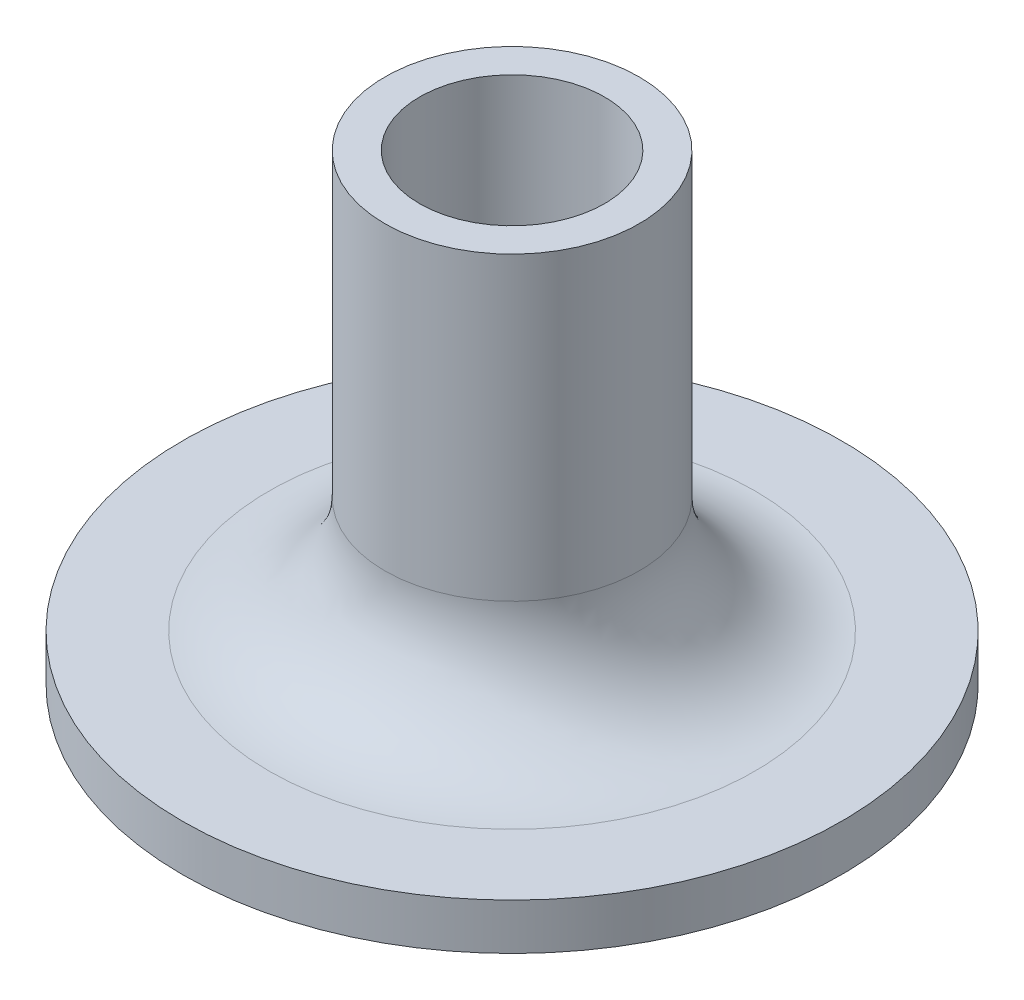
ISO-10303-21;
HEADER;
FILE_DESCRIPTION(('STEP AP214'),'2;1');
FILE_NAME('part.step','',(''),(''),'','','');
FILE_SCHEMA(('AUTOMOTIVE_DESIGN { 1 0 10303 214 1 1 1 1 }'));
ENDSEC;
DATA;
#1=APPLICATION_CONTEXT('core data for automotive mechanical design processes');
#2=APPLICATION_PROTOCOL_DEFINITION('international standard','automotive_design',2000,#1);
#3=PRODUCT_CONTEXT('',#1,'mechanical');
#4=PRODUCT('Part','Part','',(#3));
#5=PRODUCT_RELATED_PRODUCT_CATEGORY('part','',(#4));
#6=PRODUCT_DEFINITION_FORMATION('','',#4);
#7=PRODUCT_DEFINITION_CONTEXT('part definition',#1,'design');
#8=PRODUCT_DEFINITION('design','',#6,#7);
#9=PRODUCT_DEFINITION_SHAPE('','',#8);
#10=(LENGTH_UNIT() NAMED_UNIT(*) SI_UNIT(.MILLI.,.METRE.));
#11=(NAMED_UNIT(*) PLANE_ANGLE_UNIT() SI_UNIT($,.RADIAN.));
#12=(NAMED_UNIT(*) SI_UNIT($,.STERADIAN.) SOLID_ANGLE_UNIT());
#13=UNCERTAINTY_MEASURE_WITH_UNIT(LENGTH_MEASURE(1.E-05),#10,'distance_accuracy_value','');
#14=(GEOMETRIC_REPRESENTATION_CONTEXT(3) GLOBAL_UNCERTAINTY_ASSIGNED_CONTEXT((#13)) GLOBAL_UNIT_ASSIGNED_CONTEXT((#10,
#11,#12)) REPRESENTATION_CONTEXT('',''));
#15=CARTESIAN_POINT('',(0.,0.,0.));
#16=DIRECTION('',(0.,0.,1.));
#17=DIRECTION('',(1.,0.,0.));
#18=AXIS2_PLACEMENT_3D('',#15,#16,#17);
#19=CARTESIAN_POINT('',(0.,2.,0.));
#20=DIRECTION('',(0.,-1.,0.));
#21=DIRECTION('',(0.,0.,-1.));
#22=AXIS2_PLACEMENT_3D('',#19,#20,#21);
#23=CYLINDRICAL_SURFACE('',#22,14.25);
#24=CARTESIAN_POINT('',(0.,2.,0.));
#25=DIRECTION('',(0.,1.,0.));
#26=DIRECTION('',(0.,0.,1.));
#27=AXIS2_PLACEMENT_3D('',#24,#25,#26);
#28=CIRCLE('',#27,14.25);
#29=CARTESIAN_POINT('',(0.,2.,14.25));
#30=VERTEX_POINT('',#29);
#31=EDGE_CURVE('E55',#30,#30,#28,.T.);
#32=ORIENTED_EDGE('',*,*,#31,.F.);
#33=EDGE_LOOP('',(#32));
#34=FACE_BOUND('',#33,.T.);
#35=CARTESIAN_POINT('',(0.,0.,0.));
#36=DIRECTION('',(0.,1.,0.));
#37=DIRECTION('',(0.,0.,1.));
#38=AXIS2_PLACEMENT_3D('',#35,#36,#37);
#39=CIRCLE('',#38,14.25);
#40=CARTESIAN_POINT('',(0.,0.,14.25));
#41=VERTEX_POINT('',#40);
#42=EDGE_CURVE('E58',#41,#41,#39,.T.);
#43=ORIENTED_EDGE('',*,*,#42,.T.);
#44=EDGE_LOOP('',(#43));
#45=FACE_BOUND('',#44,.T.);
#46=ADVANCED_FACE('F37',(#34,#45),#23,.T.);
#47=CARTESIAN_POINT('',(0.,2.,0.));
#48=DIRECTION('',(0.,1.,0.));
#49=DIRECTION('',(0.,0.,1.));
#50=AXIS2_PLACEMENT_3D('',#47,#48,#49);
#51=PLANE('',#50);
#52=CARTESIAN_POINT('',(0.,2.,0.));
#53=DIRECTION('',(0.,1.,0.));
#54=DIRECTION('',(0.,0.,1.));
#55=AXIS2_PLACEMENT_3D('',#52,#53,#54);
#56=CIRCLE('',#55,10.5);
#57=CARTESIAN_POINT('',(0.,2.,10.5));
#58=VERTEX_POINT('',#57);
#59=EDGE_CURVE('E10',#58,#58,#56,.F.);
#60=ORIENTED_EDGE('',*,*,#59,.T.);
#61=EDGE_LOOP('',(#60));
#62=FACE_BOUND('',#61,.T.);
#63=ORIENTED_EDGE('',*,*,#31,.T.);
#64=EDGE_LOOP('',(#63));
#65=FACE_BOUND('',#64,.T.);
#66=ADVANCED_FACE('F88',(#62,#65),#51,.T.);
#67=CARTESIAN_POINT('',(0.,0.,0.));
#68=DIRECTION('',(0.,1.,0.));
#69=DIRECTION('',(0.,0.,1.));
#70=AXIS2_PLACEMENT_3D('',#67,#68,#69);
#71=PLANE('',#70);
#72=ORIENTED_EDGE('',*,*,#42,.F.);
#73=EDGE_LOOP('',(#72));
#74=FACE_BOUND('',#73,.T.);
#75=ADVANCED_FACE('F80',(#74),#71,.F.);
#76=CARTESIAN_POINT('',(0.,20.,0.));
#77=DIRECTION('',(0.,1.,0.));
#78=DIRECTION('',(0.,0.,1.));
#79=AXIS2_PLACEMENT_3D('',#76,#77,#78);
#80=PLANE('',#79);
#81=CARTESIAN_POINT('',(0.,20.,0.));
#82=DIRECTION('',(0.,1.,0.));
#83=DIRECTION('',(0.,0.,1.));
#84=AXIS2_PLACEMENT_3D('',#81,#82,#83);
#85=CIRCLE('',#84,5.5);
#86=CARTESIAN_POINT('',(0.,20.,5.5));
#87=VERTEX_POINT('',#86);
#88=EDGE_CURVE('E62',#87,#87,#85,.T.);
#89=ORIENTED_EDGE('',*,*,#88,.T.);
#90=EDGE_LOOP('',(#89));
#91=FACE_BOUND('',#90,.T.);
#92=CARTESIAN_POINT('',(0.,20.,0.));
#93=DIRECTION('',(0.,1.,0.));
#94=DIRECTION('',(0.,0.,1.));
#95=AXIS2_PLACEMENT_3D('',#92,#93,#94);
#96=CIRCLE('',#95,4.);
#97=CARTESIAN_POINT('',(0.,20.,4.));
#98=VERTEX_POINT('',#97);
#99=EDGE_CURVE('E69',#98,#98,#96,.T.);
#100=ORIENTED_EDGE('',*,*,#99,.F.);
#101=EDGE_LOOP('',(#100));
#102=FACE_BOUND('',#101,.T.);
#103=ADVANCED_FACE('F77',(#91,#102),#80,.T.);
#104=CARTESIAN_POINT('',(0.,20.,0.));
#105=DIRECTION('',(0.,-1.,0.));
#106=DIRECTION('',(0.,0.,-1.));
#107=AXIS2_PLACEMENT_3D('',#104,#105,#106);
#108=CYLINDRICAL_SURFACE('',#107,5.5);
#109=CARTESIAN_POINT('',(0.,7.,0.));
#110=DIRECTION('',(0.,1.,0.));
#111=DIRECTION('',(0.,0.,1.));
#112=AXIS2_PLACEMENT_3D('',#109,#110,#111);
#113=CIRCLE('',#112,5.5);
#114=CARTESIAN_POINT('',(0.,7.,5.5));
#115=VERTEX_POINT('',#114);
#116=EDGE_CURVE('E45',#115,#115,#113,.T.);
#117=ORIENTED_EDGE('',*,*,#116,.T.);
#118=EDGE_LOOP('',(#117));
#119=FACE_BOUND('',#118,.T.);
#120=ORIENTED_EDGE('',*,*,#88,.F.);
#121=EDGE_LOOP('',(#120));
#122=FACE_BOUND('',#121,.T.);
#123=ADVANCED_FACE('F79',(#119,#122),#108,.T.);
#124=CARTESIAN_POINT('',(0.,20.,0.));
#125=DIRECTION('',(0.,-1.,0.));
#126=DIRECTION('',(0.,0.,-1.));
#127=AXIS2_PLACEMENT_3D('',#124,#125,#126);
#128=CYLINDRICAL_SURFACE('',#127,4.);
#129=ORIENTED_EDGE('',*,*,#99,.T.);
#130=EDGE_LOOP('',(#129));
#131=FACE_BOUND('',#130,.T.);
#132=CARTESIAN_POINT('',(0.,2.,0.));
#133=DIRECTION('',(0.,1.,0.));
#134=DIRECTION('',(0.,0.,1.));
#135=AXIS2_PLACEMENT_3D('',#132,#133,#134);
#136=CIRCLE('',#135,4.);
#137=CARTESIAN_POINT('',(0.,2.,4.));
#138=VERTEX_POINT('',#137);
#139=EDGE_CURVE('E50',#138,#138,#136,.F.);
#140=ORIENTED_EDGE('',*,*,#139,.T.);
#141=EDGE_LOOP('',(#140));
#142=FACE_BOUND('',#141,.T.);
#143=ADVANCED_FACE('F74',(#131,#142),#128,.F.);
#144=ORIENTED_EDGE('',*,*,#139,.F.);
#145=EDGE_LOOP('',(#144));
#146=FACE_BOUND('',#145,.T.);
#147=ADVANCED_FACE('F98',(#146),#51,.T.);
#148=CARTESIAN_POINT('',(0.,7.,0.));
#149=DIRECTION('',(0.,1.,0.));
#150=DIRECTION('',(0.,0.,1.));
#151=AXIS2_PLACEMENT_3D('',#148,#149,#150);
#152=TOROIDAL_SURFACE('',#151,10.5,5.);
#153=ORIENTED_EDGE('',*,*,#59,.F.);
#154=EDGE_LOOP('',(#153));
#155=FACE_BOUND('',#154,.T.);
#156=ORIENTED_EDGE('',*,*,#116,.F.);
#157=EDGE_LOOP('',(#156));
#158=FACE_BOUND('',#157,.T.);
#159=ADVANCED_FACE('F39',(#155,#158),#152,.F.);
#160=CLOSED_SHELL('',(#46,#66,#75,#103,#123,#143,#147,#159));
#161=MANIFOLD_SOLID_BREP('B2',#160);
#162=ADVANCED_BREP_SHAPE_REPRESENTATION('',(#18,#161),#14);
#163=SHAPE_DEFINITION_REPRESENTATION(#9,#162);
ENDSEC;
END-ISO-10303-21;
